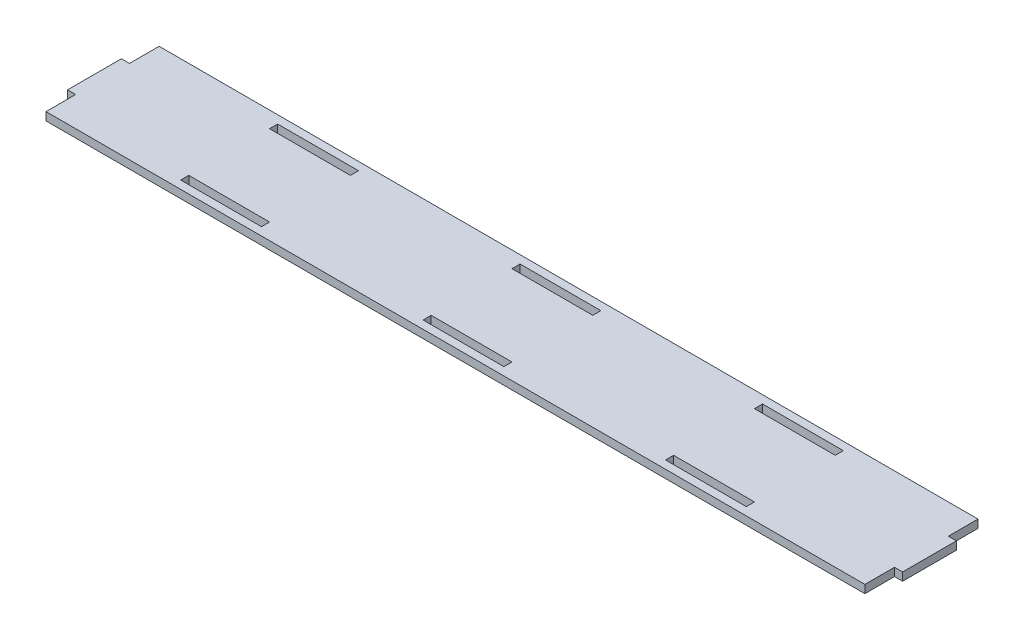
ISO-10303-21;
HEADER;
FILE_DESCRIPTION(('STEP AP214'),'2;1');
FILE_NAME('part.step','',(''),(''),'','','');
FILE_SCHEMA(('AUTOMOTIVE_DESIGN { 1 0 10303 214 1 1 1 1 }'));
ENDSEC;
DATA;
#1=APPLICATION_CONTEXT('core data for automotive mechanical design processes');
#2=APPLICATION_PROTOCOL_DEFINITION('international standard','automotive_design',2000,#1);
#3=PRODUCT_CONTEXT('',#1,'mechanical');
#4=PRODUCT('Part','Part','',(#3));
#5=PRODUCT_RELATED_PRODUCT_CATEGORY('part','',(#4));
#6=PRODUCT_DEFINITION_FORMATION('','',#4);
#7=PRODUCT_DEFINITION_CONTEXT('part definition',#1,'design');
#8=PRODUCT_DEFINITION('design','',#6,#7);
#9=PRODUCT_DEFINITION_SHAPE('','',#8);
#10=(LENGTH_UNIT() NAMED_UNIT(*) SI_UNIT(.MILLI.,.METRE.));
#11=(NAMED_UNIT(*) PLANE_ANGLE_UNIT() SI_UNIT($,.RADIAN.));
#12=(NAMED_UNIT(*) SI_UNIT($,.STERADIAN.) SOLID_ANGLE_UNIT());
#13=UNCERTAINTY_MEASURE_WITH_UNIT(LENGTH_MEASURE(1.E-05),#10,'distance_accuracy_value','');
#14=(GEOMETRIC_REPRESENTATION_CONTEXT(3) GLOBAL_UNCERTAINTY_ASSIGNED_CONTEXT((#13)) GLOBAL_UNIT_ASSIGNED_CONTEXT((#10,
#11,#12)) REPRESENTATION_CONTEXT('',''));
#15=CARTESIAN_POINT('',(0.,0.,0.));
#16=DIRECTION('',(0.,0.,1.));
#17=DIRECTION('',(1.,0.,0.));
#18=AXIS2_PLACEMENT_3D('',#15,#16,#17);
#19=CARTESIAN_POINT('',(0.,3.,0.));
#20=DIRECTION('',(0.,1.,0.));
#21=DIRECTION('',(0.,0.,1.));
#22=AXIS2_PLACEMENT_3D('',#19,#20,#21);
#23=PLANE('',#22);
#24=DIRECTION('',(0.,0.,1.));
#25=VECTOR('',#24,1.);
#26=CARTESIAN_POINT('',(0.,3.,0.));
#27=LINE('',#26,#25);
#28=CARTESIAN_POINT('',(0.,3.,-11.));
#29=VERTEX_POINT('',#28);
#30=CARTESIAN_POINT('',(0.,3.,0.));
#31=VERTEX_POINT('',#30);
#32=EDGE_CURVE('E457',#29,#31,#27,.T.);
#33=ORIENTED_EDGE('',*,*,#32,.T.);
#34=DIRECTION('',(1.,0.,0.));
#35=VECTOR('',#34,1.);
#36=CARTESIAN_POINT('',(0.,3.,0.));
#37=LINE('',#36,#35);
#38=CARTESIAN_POINT('',(304.,3.,0.));
#39=VERTEX_POINT('',#38);
#40=EDGE_CURVE('E460',#31,#39,#37,.T.);
#41=ORIENTED_EDGE('',*,*,#40,.T.);
#42=DIRECTION('',(0.,0.,-1.));
#43=VECTOR('',#42,1.);
#44=CARTESIAN_POINT('',(304.,3.,0.));
#45=LINE('',#44,#43);
#46=CARTESIAN_POINT('',(304.,3.,-11.));
#47=VERTEX_POINT('',#46);
#48=EDGE_CURVE('E463',#39,#47,#45,.T.);
#49=ORIENTED_EDGE('',*,*,#48,.T.);
#50=DIRECTION('',(1.,0.,0.));
#51=VECTOR('',#50,1.);
#52=CARTESIAN_POINT('',(304.,3.,-11.));
#53=LINE('',#52,#51);
#54=CARTESIAN_POINT('',(307.,3.,-11.));
#55=VERTEX_POINT('',#54);
#56=EDGE_CURVE('E465',#47,#55,#53,.T.);
#57=ORIENTED_EDGE('',*,*,#56,.T.);
#58=DIRECTION('',(0.,0.,-1.));
#59=VECTOR('',#58,1.);
#60=CARTESIAN_POINT('',(307.,3.,-31.));
#61=LINE('',#60,#59);
#62=CARTESIAN_POINT('',(307.,3.,-31.));
#63=VERTEX_POINT('',#62);
#64=EDGE_CURVE('E467',#55,#63,#61,.T.);
#65=ORIENTED_EDGE('',*,*,#64,.T.);
#66=DIRECTION('',(-1.,0.,0.));
#67=VECTOR('',#66,1.);
#68=CARTESIAN_POINT('',(304.,3.,-31.));
#69=LINE('',#68,#67);
#70=CARTESIAN_POINT('',(304.,3.,-31.));
#71=VERTEX_POINT('',#70);
#72=EDGE_CURVE('E469',#63,#71,#69,.T.);
#73=ORIENTED_EDGE('',*,*,#72,.T.);
#74=DIRECTION('',(0.,0.,-1.));
#75=VECTOR('',#74,1.);
#76=CARTESIAN_POINT('',(304.,3.,-31.));
#77=LINE('',#76,#75);
#78=CARTESIAN_POINT('',(304.,3.,-42.));
#79=VERTEX_POINT('',#78);
#80=EDGE_CURVE('E471',#71,#79,#77,.T.);
#81=ORIENTED_EDGE('',*,*,#80,.T.);
#82=DIRECTION('',(-1.,0.,0.));
#83=VECTOR('',#82,1.);
#84=CARTESIAN_POINT('',(0.,3.,-42.));
#85=LINE('',#84,#83);
#86=CARTESIAN_POINT('',(0.,3.,-42.));
#87=VERTEX_POINT('',#86);
#88=EDGE_CURVE('E473',#79,#87,#85,.T.);
#89=ORIENTED_EDGE('',*,*,#88,.T.);
#90=DIRECTION('',(0.,0.,1.));
#91=VECTOR('',#90,1.);
#92=CARTESIAN_POINT('',(0.,3.,-31.));
#93=LINE('',#92,#91);
#94=CARTESIAN_POINT('',(0.,3.,-31.));
#95=VERTEX_POINT('',#94);
#96=EDGE_CURVE('E475',#87,#95,#93,.T.);
#97=ORIENTED_EDGE('',*,*,#96,.T.);
#98=DIRECTION('',(-1.,0.,0.));
#99=VECTOR('',#98,1.);
#100=CARTESIAN_POINT('',(0.,3.,-31.));
#101=LINE('',#100,#99);
#102=CARTESIAN_POINT('',(-3.,3.,-31.));
#103=VERTEX_POINT('',#102);
#104=EDGE_CURVE('E477',#95,#103,#101,.T.);
#105=ORIENTED_EDGE('',*,*,#104,.T.);
#106=DIRECTION('',(0.,0.,1.));
#107=VECTOR('',#106,1.);
#108=CARTESIAN_POINT('',(-3.,3.,-31.));
#109=LINE('',#108,#107);
#110=CARTESIAN_POINT('',(-3.,3.,-11.));
#111=VERTEX_POINT('',#110);
#112=EDGE_CURVE('E479',#103,#111,#109,.T.);
#113=ORIENTED_EDGE('',*,*,#112,.T.);
#114=DIRECTION('',(1.,0.,0.));
#115=VECTOR('',#114,1.);
#116=CARTESIAN_POINT('',(0.,3.,-11.));
#117=LINE('',#116,#115);
#118=EDGE_CURVE('E481',#111,#29,#117,.T.);
#119=ORIENTED_EDGE('',*,*,#118,.T.);
#120=EDGE_LOOP('',(#33,#41,#49,#57,#65,#73,#81,#89,#97,#105,#113,#119));
#121=FACE_BOUND('',#120,.T.);
#122=DIRECTION('',(1.,0.,0.));
#123=VECTOR('',#122,1.);
#124=CARTESIAN_POINT('',(47.,3.,-3.));
#125=LINE('',#124,#123);
#126=CARTESIAN_POINT('',(47.,3.,-3.));
#127=VERTEX_POINT('',#126);
#128=CARTESIAN_POINT('',(77.,3.,-3.));
#129=VERTEX_POINT('',#128);
#130=EDGE_CURVE('E428',#127,#129,#125,.T.);
#131=ORIENTED_EDGE('',*,*,#130,.F.);
#132=DIRECTION('',(0.,0.,1.));
#133=VECTOR('',#132,1.);
#134=CARTESIAN_POINT('',(47.,3.,-6.));
#135=LINE('',#134,#133);
#136=CARTESIAN_POINT('',(47.,3.,-6.));
#137=VERTEX_POINT('',#136);
#138=EDGE_CURVE('E426',#137,#127,#135,.T.);
#139=ORIENTED_EDGE('',*,*,#138,.F.);
#140=DIRECTION('',(-1.,0.,0.));
#141=VECTOR('',#140,1.);
#142=CARTESIAN_POINT('',(47.,3.,-6.));
#143=LINE('',#142,#141);
#144=CARTESIAN_POINT('',(77.,3.,-6.));
#145=VERTEX_POINT('',#144);
#146=EDGE_CURVE('E434',#145,#137,#143,.T.);
#147=ORIENTED_EDGE('',*,*,#146,.F.);
#148=DIRECTION('',(0.,0.,-1.));
#149=VECTOR('',#148,1.);
#150=CARTESIAN_POINT('',(77.,3.,-6.));
#151=LINE('',#150,#149);
#152=EDGE_CURVE('E431',#129,#145,#151,.T.);
#153=ORIENTED_EDGE('',*,*,#152,.F.);
#154=EDGE_LOOP('',(#131,#139,#147,#153));
#155=FACE_BOUND('',#154,.T.);
#156=DIRECTION('',(1.,0.,0.));
#157=VECTOR('',#156,1.);
#158=CARTESIAN_POINT('',(137.,3.,-3.));
#159=LINE('',#158,#157);
#160=CARTESIAN_POINT('',(137.,3.,-3.));
#161=VERTEX_POINT('',#160);
#162=CARTESIAN_POINT('',(167.,3.,-3.00000000000001));
#163=VERTEX_POINT('',#162);
#164=EDGE_CURVE('E397',#161,#163,#159,.T.);
#165=ORIENTED_EDGE('',*,*,#164,.F.);
#166=DIRECTION('',(0.,0.,1.));
#167=VECTOR('',#166,1.);
#168=CARTESIAN_POINT('',(137.,3.,-6.00000000000001));
#169=LINE('',#168,#167);
#170=CARTESIAN_POINT('',(137.,3.,-6.00000000000001));
#171=VERTEX_POINT('',#170);
#172=EDGE_CURVE('E395',#171,#161,#169,.T.);
#173=ORIENTED_EDGE('',*,*,#172,.F.);
#174=DIRECTION('',(-1.,0.,0.));
#175=VECTOR('',#174,1.);
#176=CARTESIAN_POINT('',(137.,3.,-6.00000000000001));
#177=LINE('',#176,#175);
#178=CARTESIAN_POINT('',(167.,3.,-6.00000000000001));
#179=VERTEX_POINT('',#178);
#180=EDGE_CURVE('E403',#179,#171,#177,.T.);
#181=ORIENTED_EDGE('',*,*,#180,.F.);
#182=DIRECTION('',(0.,0.,-1.));
#183=VECTOR('',#182,1.);
#184=CARTESIAN_POINT('',(167.,3.,-6.00000000000001));
#185=LINE('',#184,#183);
#186=EDGE_CURVE('E400',#163,#179,#185,.T.);
#187=ORIENTED_EDGE('',*,*,#186,.F.);
#188=EDGE_LOOP('',(#165,#173,#181,#187));
#189=FACE_BOUND('',#188,.T.);
#190=DIRECTION('',(1.,0.,0.));
#191=VECTOR('',#190,1.);
#192=CARTESIAN_POINT('',(227.,3.,-3.));
#193=LINE('',#192,#191);
#194=CARTESIAN_POINT('',(227.,3.,-3.));
#195=VERTEX_POINT('',#194);
#196=CARTESIAN_POINT('',(257.,3.,-3.));
#197=VERTEX_POINT('',#196);
#198=EDGE_CURVE('E366',#195,#197,#193,.T.);
#199=ORIENTED_EDGE('',*,*,#198,.F.);
#200=DIRECTION('',(0.,0.,1.));
#201=VECTOR('',#200,1.);
#202=CARTESIAN_POINT('',(227.,3.,-6.));
#203=LINE('',#202,#201);
#204=CARTESIAN_POINT('',(227.,3.,-6.));
#205=VERTEX_POINT('',#204);
#206=EDGE_CURVE('E364',#205,#195,#203,.T.);
#207=ORIENTED_EDGE('',*,*,#206,.F.);
#208=DIRECTION('',(-1.,0.,0.));
#209=VECTOR('',#208,1.);
#210=CARTESIAN_POINT('',(227.,3.,-6.));
#211=LINE('',#210,#209);
#212=CARTESIAN_POINT('',(257.,3.,-6.));
#213=VERTEX_POINT('',#212);
#214=EDGE_CURVE('E372',#213,#205,#211,.T.);
#215=ORIENTED_EDGE('',*,*,#214,.F.);
#216=DIRECTION('',(0.,0.,-1.));
#217=VECTOR('',#216,1.);
#218=CARTESIAN_POINT('',(257.,3.,-6.));
#219=LINE('',#218,#217);
#220=EDGE_CURVE('E369',#197,#213,#219,.T.);
#221=ORIENTED_EDGE('',*,*,#220,.F.);
#222=EDGE_LOOP('',(#199,#207,#215,#221));
#223=FACE_BOUND('',#222,.T.);
#224=DIRECTION('',(0.,0.,-1.));
#225=VECTOR('',#224,1.);
#226=CARTESIAN_POINT('',(257.,3.,-36.));
#227=LINE('',#226,#225);
#228=CARTESIAN_POINT('',(257.,3.,-36.));
#229=VERTEX_POINT('',#228);
#230=CARTESIAN_POINT('',(257.,3.,-39.));
#231=VERTEX_POINT('',#230);
#232=EDGE_CURVE('E335',#229,#231,#227,.T.);
#233=ORIENTED_EDGE('',*,*,#232,.F.);
#234=DIRECTION('',(1.,0.,0.));
#235=VECTOR('',#234,1.);
#236=CARTESIAN_POINT('',(227.,3.,-36.));
#237=LINE('',#236,#235);
#238=CARTESIAN_POINT('',(227.,3.,-36.));
#239=VERTEX_POINT('',#238);
#240=EDGE_CURVE('E333',#239,#229,#237,.T.);
#241=ORIENTED_EDGE('',*,*,#240,.F.);
#242=DIRECTION('',(0.,0.,1.));
#243=VECTOR('',#242,1.);
#244=CARTESIAN_POINT('',(227.,3.,-36.));
#245=LINE('',#244,#243);
#246=CARTESIAN_POINT('',(227.,3.,-39.));
#247=VERTEX_POINT('',#246);
#248=EDGE_CURVE('E341',#247,#239,#245,.T.);
#249=ORIENTED_EDGE('',*,*,#248,.F.);
#250=DIRECTION('',(-1.,0.,0.));
#251=VECTOR('',#250,1.);
#252=CARTESIAN_POINT('',(227.,3.,-39.));
#253=LINE('',#252,#251);
#254=EDGE_CURVE('E338',#231,#247,#253,.T.);
#255=ORIENTED_EDGE('',*,*,#254,.F.);
#256=EDGE_LOOP('',(#233,#241,#249,#255));
#257=FACE_BOUND('',#256,.T.);
#258=DIRECTION('',(0.,0.,-1.));
#259=VECTOR('',#258,1.);
#260=CARTESIAN_POINT('',(167.,3.,-36.));
#261=LINE('',#260,#259);
#262=CARTESIAN_POINT('',(167.,3.,-36.));
#263=VERTEX_POINT('',#262);
#264=CARTESIAN_POINT('',(167.,3.,-39.));
#265=VERTEX_POINT('',#264);
#266=EDGE_CURVE('E304',#263,#265,#261,.T.);
#267=ORIENTED_EDGE('',*,*,#266,.F.);
#268=DIRECTION('',(1.,0.,0.));
#269=VECTOR('',#268,1.);
#270=CARTESIAN_POINT('',(137.,3.,-36.));
#271=LINE('',#270,#269);
#272=CARTESIAN_POINT('',(137.,3.,-36.));
#273=VERTEX_POINT('',#272);
#274=EDGE_CURVE('E302',#273,#263,#271,.T.);
#275=ORIENTED_EDGE('',*,*,#274,.F.);
#276=DIRECTION('',(0.,0.,1.));
#277=VECTOR('',#276,1.);
#278=CARTESIAN_POINT('',(137.,3.,-36.));
#279=LINE('',#278,#277);
#280=CARTESIAN_POINT('',(137.,3.,-39.));
#281=VERTEX_POINT('',#280);
#282=EDGE_CURVE('E310',#281,#273,#279,.T.);
#283=ORIENTED_EDGE('',*,*,#282,.F.);
#284=DIRECTION('',(-1.,0.,0.));
#285=VECTOR('',#284,1.);
#286=CARTESIAN_POINT('',(137.,3.,-39.));
#287=LINE('',#286,#285);
#288=EDGE_CURVE('E307',#265,#281,#287,.T.);
#289=ORIENTED_EDGE('',*,*,#288,.F.);
#290=EDGE_LOOP('',(#267,#275,#283,#289));
#291=FACE_BOUND('',#290,.T.);
#292=DIRECTION('',(0.,0.,-1.));
#293=VECTOR('',#292,1.);
#294=CARTESIAN_POINT('',(77.,3.,-36.));
#295=LINE('',#294,#293);
#296=CARTESIAN_POINT('',(77.,3.,-36.));
#297=VERTEX_POINT('',#296);
#298=CARTESIAN_POINT('',(77.,3.,-39.));
#299=VERTEX_POINT('',#298);
#300=EDGE_CURVE('E274',#297,#299,#295,.T.);
#301=ORIENTED_EDGE('',*,*,#300,.F.);
#302=DIRECTION('',(1.,0.,0.));
#303=VECTOR('',#302,1.);
#304=CARTESIAN_POINT('',(47.,3.,-36.));
#305=LINE('',#304,#303);
#306=CARTESIAN_POINT('',(47.,3.,-36.));
#307=VERTEX_POINT('',#306);
#308=EDGE_CURVE('E266',#307,#297,#305,.T.);
#309=ORIENTED_EDGE('',*,*,#308,.F.);
#310=DIRECTION('',(0.,0.,1.));
#311=VECTOR('',#310,1.);
#312=CARTESIAN_POINT('',(47.,3.,-36.));
#313=LINE('',#312,#311);
#314=CARTESIAN_POINT('',(47.,3.,-39.));
#315=VERTEX_POINT('',#314);
#316=EDGE_CURVE('E288',#315,#307,#313,.T.);
#317=ORIENTED_EDGE('',*,*,#316,.F.);
#318=DIRECTION('',(-1.,0.,0.));
#319=VECTOR('',#318,1.);
#320=CARTESIAN_POINT('',(47.,3.,-39.));
#321=LINE('',#320,#319);
#322=EDGE_CURVE('E286',#299,#315,#321,.T.);
#323=ORIENTED_EDGE('',*,*,#322,.F.);
#324=EDGE_LOOP('',(#301,#309,#317,#323));
#325=FACE_BOUND('',#324,.T.);
#326=ADVANCED_FACE('F33',(#121,#155,#189,#223,#257,#291,#325),#23,.T.);
#327=CARTESIAN_POINT('',(0.,0.,0.));
#328=DIRECTION('',(0.,1.,0.));
#329=DIRECTION('',(0.,0.,1.));
#330=AXIS2_PLACEMENT_3D('',#327,#328,#329);
#331=PLANE('',#330);
#332=DIRECTION('',(1.,0.,0.));
#333=VECTOR('',#332,1.);
#334=CARTESIAN_POINT('',(137.,0.,-36.));
#335=LINE('',#334,#333);
#336=CARTESIAN_POINT('',(137.,0.,-36.));
#337=VERTEX_POINT('',#336);
#338=CARTESIAN_POINT('',(167.,0.,-36.));
#339=VERTEX_POINT('',#338);
#340=EDGE_CURVE('E282',#337,#339,#335,.T.);
#341=ORIENTED_EDGE('',*,*,#340,.T.);
#342=DIRECTION('',(0.,0.,-1.));
#343=VECTOR('',#342,1.);
#344=CARTESIAN_POINT('',(167.,0.,-36.));
#345=LINE('',#344,#343);
#346=CARTESIAN_POINT('',(167.,0.,-39.));
#347=VERTEX_POINT('',#346);
#348=EDGE_CURVE('E315',#339,#347,#345,.T.);
#349=ORIENTED_EDGE('',*,*,#348,.T.);
#350=DIRECTION('',(-1.,0.,0.));
#351=VECTOR('',#350,1.);
#352=CARTESIAN_POINT('',(137.,0.,-39.));
#353=LINE('',#352,#351);
#354=CARTESIAN_POINT('',(137.,0.,-39.));
#355=VERTEX_POINT('',#354);
#356=EDGE_CURVE('E318',#347,#355,#353,.T.);
#357=ORIENTED_EDGE('',*,*,#356,.T.);
#358=DIRECTION('',(0.,0.,1.));
#359=VECTOR('',#358,1.);
#360=CARTESIAN_POINT('',(137.,0.,-36.));
#361=LINE('',#360,#359);
#362=EDGE_CURVE('E305',#355,#337,#361,.T.);
#363=ORIENTED_EDGE('',*,*,#362,.T.);
#364=EDGE_LOOP('',(#341,#349,#357,#363));
#365=FACE_BOUND('',#364,.T.);
#366=DIRECTION('',(0.,0.,1.));
#367=VECTOR('',#366,1.);
#368=CARTESIAN_POINT('',(227.,0.,-6.));
#369=LINE('',#368,#367);
#370=CARTESIAN_POINT('',(227.,0.,-6.));
#371=VERTEX_POINT('',#370);
#372=CARTESIAN_POINT('',(227.,0.,-3.));
#373=VERTEX_POINT('',#372);
#374=EDGE_CURVE('E363',#371,#373,#369,.T.);
#375=ORIENTED_EDGE('',*,*,#374,.T.);
#376=DIRECTION('',(1.,0.,0.));
#377=VECTOR('',#376,1.);
#378=CARTESIAN_POINT('',(227.,0.,-3.));
#379=LINE('',#378,#377);
#380=CARTESIAN_POINT('',(257.,0.,-3.));
#381=VERTEX_POINT('',#380);
#382=EDGE_CURVE('E377',#373,#381,#379,.T.);
#383=ORIENTED_EDGE('',*,*,#382,.T.);
#384=DIRECTION('',(0.,0.,-1.));
#385=VECTOR('',#384,1.);
#386=CARTESIAN_POINT('',(257.,0.,-6.));
#387=LINE('',#386,#385);
#388=CARTESIAN_POINT('',(257.,0.,-6.));
#389=VERTEX_POINT('',#388);
#390=EDGE_CURVE('E380',#381,#389,#387,.T.);
#391=ORIENTED_EDGE('',*,*,#390,.T.);
#392=DIRECTION('',(-1.,0.,0.));
#393=VECTOR('',#392,1.);
#394=CARTESIAN_POINT('',(227.,0.,-6.));
#395=LINE('',#394,#393);
#396=EDGE_CURVE('E367',#389,#371,#395,.T.);
#397=ORIENTED_EDGE('',*,*,#396,.T.);
#398=EDGE_LOOP('',(#375,#383,#391,#397));
#399=FACE_BOUND('',#398,.T.);
#400=DIRECTION('',(0.,0.,1.));
#401=VECTOR('',#400,1.);
#402=CARTESIAN_POINT('',(47.,0.,-6.));
#403=LINE('',#402,#401);
#404=CARTESIAN_POINT('',(47.,0.,-6.));
#405=VERTEX_POINT('',#404);
#406=CARTESIAN_POINT('',(47.,0.,-3.));
#407=VERTEX_POINT('',#406);
#408=EDGE_CURVE('E425',#405,#407,#403,.T.);
#409=ORIENTED_EDGE('',*,*,#408,.T.);
#410=DIRECTION('',(1.,0.,0.));
#411=VECTOR('',#410,1.);
#412=CARTESIAN_POINT('',(47.,0.,-3.));
#413=LINE('',#412,#411);
#414=CARTESIAN_POINT('',(77.,0.,-3.));
#415=VERTEX_POINT('',#414);
#416=EDGE_CURVE('E439',#407,#415,#413,.T.);
#417=ORIENTED_EDGE('',*,*,#416,.T.);
#418=DIRECTION('',(0.,0.,-1.));
#419=VECTOR('',#418,1.);
#420=CARTESIAN_POINT('',(77.,0.,-6.));
#421=LINE('',#420,#419);
#422=CARTESIAN_POINT('',(77.,0.,-6.));
#423=VERTEX_POINT('',#422);
#424=EDGE_CURVE('E442',#415,#423,#421,.T.);
#425=ORIENTED_EDGE('',*,*,#424,.T.);
#426=DIRECTION('',(-1.,0.,0.));
#427=VECTOR('',#426,1.);
#428=CARTESIAN_POINT('',(47.,0.,-6.));
#429=LINE('',#428,#427);
#430=EDGE_CURVE('E429',#423,#405,#429,.T.);
#431=ORIENTED_EDGE('',*,*,#430,.T.);
#432=EDGE_LOOP('',(#409,#417,#425,#431));
#433=FACE_BOUND('',#432,.T.);
#434=DIRECTION('',(0.,0.,1.));
#435=VECTOR('',#434,1.);
#436=CARTESIAN_POINT('',(0.,0.,0.));
#437=LINE('',#436,#435);
#438=CARTESIAN_POINT('',(0.,0.,-11.));
#439=VERTEX_POINT('',#438);
#440=CARTESIAN_POINT('',(0.,0.,0.));
#441=VERTEX_POINT('',#440);
#442=EDGE_CURVE('E456',#439,#441,#437,.T.);
#443=ORIENTED_EDGE('',*,*,#442,.F.);
#444=DIRECTION('',(1.,0.,0.));
#445=VECTOR('',#444,1.);
#446=CARTESIAN_POINT('',(0.,0.,-11.));
#447=LINE('',#446,#445);
#448=CARTESIAN_POINT('',(-3.,0.,-11.));
#449=VERTEX_POINT('',#448);
#450=EDGE_CURVE('E461',#449,#439,#447,.T.);
#451=ORIENTED_EDGE('',*,*,#450,.F.);
#452=DIRECTION('',(0.,0.,1.));
#453=VECTOR('',#452,1.);
#454=CARTESIAN_POINT('',(-3.,0.,-31.));
#455=LINE('',#454,#453);
#456=CARTESIAN_POINT('',(-3.,0.,-31.));
#457=VERTEX_POINT('',#456);
#458=EDGE_CURVE('E504',#457,#449,#455,.T.);
#459=ORIENTED_EDGE('',*,*,#458,.F.);
#460=DIRECTION('',(-1.,0.,0.));
#461=VECTOR('',#460,1.);
#462=CARTESIAN_POINT('',(0.,0.,-31.));
#463=LINE('',#462,#461);
#464=CARTESIAN_POINT('',(0.,0.,-31.));
#465=VERTEX_POINT('',#464);
#466=EDGE_CURVE('E502',#465,#457,#463,.T.);
#467=ORIENTED_EDGE('',*,*,#466,.F.);
#468=DIRECTION('',(0.,0.,1.));
#469=VECTOR('',#468,1.);
#470=CARTESIAN_POINT('',(0.,0.,-31.));
#471=LINE('',#470,#469);
#472=CARTESIAN_POINT('',(0.,0.,-42.));
#473=VERTEX_POINT('',#472);
#474=EDGE_CURVE('E500',#473,#465,#471,.T.);
#475=ORIENTED_EDGE('',*,*,#474,.F.);
#476=DIRECTION('',(-1.,0.,0.));
#477=VECTOR('',#476,1.);
#478=CARTESIAN_POINT('',(0.,0.,-42.));
#479=LINE('',#478,#477);
#480=CARTESIAN_POINT('',(304.,0.,-42.));
#481=VERTEX_POINT('',#480);
#482=EDGE_CURVE('E498',#481,#473,#479,.T.);
#483=ORIENTED_EDGE('',*,*,#482,.F.);
#484=DIRECTION('',(0.,0.,-1.));
#485=VECTOR('',#484,1.);
#486=CARTESIAN_POINT('',(304.,0.,-31.));
#487=LINE('',#486,#485);
#488=CARTESIAN_POINT('',(304.,0.,-31.));
#489=VERTEX_POINT('',#488);
#490=EDGE_CURVE('E496',#489,#481,#487,.T.);
#491=ORIENTED_EDGE('',*,*,#490,.F.);
#492=DIRECTION('',(-1.,0.,0.));
#493=VECTOR('',#492,1.);
#494=CARTESIAN_POINT('',(304.,0.,-31.));
#495=LINE('',#494,#493);
#496=CARTESIAN_POINT('',(307.,0.,-31.));
#497=VERTEX_POINT('',#496);
#498=EDGE_CURVE('E494',#497,#489,#495,.T.);
#499=ORIENTED_EDGE('',*,*,#498,.F.);
#500=DIRECTION('',(0.,0.,-1.));
#501=VECTOR('',#500,1.);
#502=CARTESIAN_POINT('',(307.,0.,-31.));
#503=LINE('',#502,#501);
#504=CARTESIAN_POINT('',(307.,0.,-11.));
#505=VERTEX_POINT('',#504);
#506=EDGE_CURVE('E492',#505,#497,#503,.T.);
#507=ORIENTED_EDGE('',*,*,#506,.F.);
#508=DIRECTION('',(1.,0.,0.));
#509=VECTOR('',#508,1.);
#510=CARTESIAN_POINT('',(304.,0.,-11.));
#511=LINE('',#510,#509);
#512=CARTESIAN_POINT('',(304.,0.,-11.));
#513=VERTEX_POINT('',#512);
#514=EDGE_CURVE('E490',#513,#505,#511,.T.);
#515=ORIENTED_EDGE('',*,*,#514,.F.);
#516=DIRECTION('',(0.,0.,-1.));
#517=VECTOR('',#516,1.);
#518=CARTESIAN_POINT('',(304.,0.,0.));
#519=LINE('',#518,#517);
#520=CARTESIAN_POINT('',(304.,0.,0.));
#521=VERTEX_POINT('',#520);
#522=EDGE_CURVE('E488',#521,#513,#519,.T.);
#523=ORIENTED_EDGE('',*,*,#522,.F.);
#524=DIRECTION('',(1.,0.,0.));
#525=VECTOR('',#524,1.);
#526=CARTESIAN_POINT('',(0.,0.,0.));
#527=LINE('',#526,#525);
#528=EDGE_CURVE('E486',#441,#521,#527,.T.);
#529=ORIENTED_EDGE('',*,*,#528,.F.);
#530=EDGE_LOOP('',(#443,#451,#459,#467,#475,#483,#491,#499,#507,#515,#523,#529));
#531=FACE_BOUND('',#530,.T.);
#532=DIRECTION('',(0.,0.,1.));
#533=VECTOR('',#532,1.);
#534=CARTESIAN_POINT('',(137.,0.,-6.00000000000001));
#535=LINE('',#534,#533);
#536=CARTESIAN_POINT('',(137.,0.,-6.00000000000001));
#537=VERTEX_POINT('',#536);
#538=CARTESIAN_POINT('',(137.,0.,-3.));
#539=VERTEX_POINT('',#538);
#540=EDGE_CURVE('E394',#537,#539,#535,.T.);
#541=ORIENTED_EDGE('',*,*,#540,.T.);
#542=DIRECTION('',(1.,0.,0.));
#543=VECTOR('',#542,1.);
#544=CARTESIAN_POINT('',(137.,0.,-3.));
#545=LINE('',#544,#543);
#546=CARTESIAN_POINT('',(167.,0.,-3.00000000000001));
#547=VERTEX_POINT('',#546);
#548=EDGE_CURVE('E408',#539,#547,#545,.T.);
#549=ORIENTED_EDGE('',*,*,#548,.T.);
#550=DIRECTION('',(0.,0.,-1.));
#551=VECTOR('',#550,1.);
#552=CARTESIAN_POINT('',(167.,0.,-6.00000000000001));
#553=LINE('',#552,#551);
#554=CARTESIAN_POINT('',(167.,0.,-6.00000000000001));
#555=VERTEX_POINT('',#554);
#556=EDGE_CURVE('E411',#547,#555,#553,.T.);
#557=ORIENTED_EDGE('',*,*,#556,.T.);
#558=DIRECTION('',(-1.,0.,0.));
#559=VECTOR('',#558,1.);
#560=CARTESIAN_POINT('',(137.,0.,-6.00000000000001));
#561=LINE('',#560,#559);
#562=EDGE_CURVE('E398',#555,#537,#561,.T.);
#563=ORIENTED_EDGE('',*,*,#562,.T.);
#564=EDGE_LOOP('',(#541,#549,#557,#563));
#565=FACE_BOUND('',#564,.T.);
#566=DIRECTION('',(1.,0.,0.));
#567=VECTOR('',#566,1.);
#568=CARTESIAN_POINT('',(227.,0.,-36.));
#569=LINE('',#568,#567);
#570=CARTESIAN_POINT('',(227.,0.,-36.));
#571=VERTEX_POINT('',#570);
#572=CARTESIAN_POINT('',(257.,0.,-36.));
#573=VERTEX_POINT('',#572);
#574=EDGE_CURVE('E332',#571,#573,#569,.T.);
#575=ORIENTED_EDGE('',*,*,#574,.T.);
#576=DIRECTION('',(0.,0.,-1.));
#577=VECTOR('',#576,1.);
#578=CARTESIAN_POINT('',(257.,0.,-36.));
#579=LINE('',#578,#577);
#580=CARTESIAN_POINT('',(257.,0.,-39.));
#581=VERTEX_POINT('',#580);
#582=EDGE_CURVE('E346',#573,#581,#579,.T.);
#583=ORIENTED_EDGE('',*,*,#582,.T.);
#584=DIRECTION('',(-1.,0.,0.));
#585=VECTOR('',#584,1.);
#586=CARTESIAN_POINT('',(227.,0.,-39.));
#587=LINE('',#586,#585);
#588=CARTESIAN_POINT('',(227.,0.,-39.));
#589=VERTEX_POINT('',#588);
#590=EDGE_CURVE('E349',#581,#589,#587,.T.);
#591=ORIENTED_EDGE('',*,*,#590,.T.);
#592=DIRECTION('',(0.,0.,1.));
#593=VECTOR('',#592,1.);
#594=CARTESIAN_POINT('',(227.,0.,-36.));
#595=LINE('',#594,#593);
#596=EDGE_CURVE('E336',#589,#571,#595,.T.);
#597=ORIENTED_EDGE('',*,*,#596,.T.);
#598=EDGE_LOOP('',(#575,#583,#591,#597));
#599=FACE_BOUND('',#598,.T.);
#600=DIRECTION('',(1.,0.,0.));
#601=VECTOR('',#600,1.);
#602=CARTESIAN_POINT('',(47.,0.,-36.));
#603=LINE('',#602,#601);
#604=CARTESIAN_POINT('',(47.,0.,-36.));
#605=VERTEX_POINT('',#604);
#606=CARTESIAN_POINT('',(77.,0.,-36.));
#607=VERTEX_POINT('',#606);
#608=EDGE_CURVE('E56',#605,#607,#603,.T.);
#609=ORIENTED_EDGE('',*,*,#608,.T.);
#610=DIRECTION('',(0.,0.,-1.));
#611=VECTOR('',#610,1.);
#612=CARTESIAN_POINT('',(77.,0.,-36.));
#613=LINE('',#612,#611);
#614=CARTESIAN_POINT('',(77.,0.,-39.));
#615=VERTEX_POINT('',#614);
#616=EDGE_CURVE('E281',#607,#615,#613,.T.);
#617=ORIENTED_EDGE('',*,*,#616,.T.);
#618=DIRECTION('',(-1.,0.,0.));
#619=VECTOR('',#618,1.);
#620=CARTESIAN_POINT('',(47.,0.,-39.));
#621=LINE('',#620,#619);
#622=CARTESIAN_POINT('',(47.,0.,-39.));
#623=VERTEX_POINT('',#622);
#624=EDGE_CURVE('E294',#615,#623,#621,.T.);
#625=ORIENTED_EDGE('',*,*,#624,.T.);
#626=DIRECTION('',(0.,0.,1.));
#627=VECTOR('',#626,1.);
#628=CARTESIAN_POINT('',(47.,0.,-36.));
#629=LINE('',#628,#627);
#630=EDGE_CURVE('E275',#623,#605,#629,.T.);
#631=ORIENTED_EDGE('',*,*,#630,.T.);
#632=EDGE_LOOP('',(#609,#617,#625,#631));
#633=FACE_BOUND('',#632,.T.);
#634=ADVANCED_FACE('F546',(#365,#399,#433,#531,#565,#599,#633),#331,.F.);
#635=CARTESIAN_POINT('',(0.,3.,0.));
#636=DIRECTION('',(1.,0.,0.));
#637=DIRECTION('',(0.,0.,-1.));
#638=AXIS2_PLACEMENT_3D('',#635,#636,#637);
#639=PLANE('',#638);
#640=ORIENTED_EDGE('',*,*,#442,.T.);
#641=DIRECTION('',(0.,-1.,0.));
#642=VECTOR('',#641,1.);
#643=CARTESIAN_POINT('',(0.,3.,0.));
#644=LINE('',#643,#642);
#645=EDGE_CURVE('E11',#31,#441,#644,.T.);
#646=ORIENTED_EDGE('',*,*,#645,.F.);
#647=ORIENTED_EDGE('',*,*,#32,.F.);
#648=DIRECTION('',(0.,-1.,0.));
#649=VECTOR('',#648,1.);
#650=CARTESIAN_POINT('',(0.,3.,-11.));
#651=LINE('',#650,#649);
#652=EDGE_CURVE('E483',#29,#439,#651,.T.);
#653=ORIENTED_EDGE('',*,*,#652,.T.);
#654=EDGE_LOOP('',(#640,#646,#647,#653));
#655=FACE_BOUND('',#654,.T.);
#656=ADVANCED_FACE('F35',(#655),#639,.F.);
#657=CARTESIAN_POINT('',(0.,3.,0.));
#658=DIRECTION('',(0.,0.,-1.));
#659=DIRECTION('',(-1.,0.,0.));
#660=AXIS2_PLACEMENT_3D('',#657,#658,#659);
#661=PLANE('',#660);
#662=ORIENTED_EDGE('',*,*,#528,.T.);
#663=DIRECTION('',(0.,-1.,0.));
#664=VECTOR('',#663,1.);
#665=CARTESIAN_POINT('',(304.,3.,0.));
#666=LINE('',#665,#664);
#667=EDGE_CURVE('E41',#39,#521,#666,.T.);
#668=ORIENTED_EDGE('',*,*,#667,.F.);
#669=ORIENTED_EDGE('',*,*,#40,.F.);
#670=ORIENTED_EDGE('',*,*,#645,.T.);
#671=EDGE_LOOP('',(#662,#668,#669,#670));
#672=FACE_BOUND('',#671,.T.);
#673=ADVANCED_FACE('F564',(#672),#661,.F.);
#674=CARTESIAN_POINT('',(304.,3.,0.));
#675=DIRECTION('',(-1.,0.,0.));
#676=DIRECTION('',(0.,0.,1.));
#677=AXIS2_PLACEMENT_3D('',#674,#675,#676);
#678=PLANE('',#677);
#679=ORIENTED_EDGE('',*,*,#522,.T.);
#680=DIRECTION('',(0.,-1.,0.));
#681=VECTOR('',#680,1.);
#682=CARTESIAN_POINT('',(304.,3.,-11.));
#683=LINE('',#682,#681);
#684=EDGE_CURVE('E533',#47,#513,#683,.T.);
#685=ORIENTED_EDGE('',*,*,#684,.F.);
#686=ORIENTED_EDGE('',*,*,#48,.F.);
#687=ORIENTED_EDGE('',*,*,#667,.T.);
#688=EDGE_LOOP('',(#679,#685,#686,#687));
#689=FACE_BOUND('',#688,.T.);
#690=ADVANCED_FACE('F540',(#689),#678,.F.);
#691=CARTESIAN_POINT('',(304.,3.,-11.));
#692=DIRECTION('',(0.,0.,-1.));
#693=DIRECTION('',(-1.,0.,0.));
#694=AXIS2_PLACEMENT_3D('',#691,#692,#693);
#695=PLANE('',#694);
#696=ORIENTED_EDGE('',*,*,#514,.T.);
#697=DIRECTION('',(0.,-1.,0.));
#698=VECTOR('',#697,1.);
#699=CARTESIAN_POINT('',(307.,3.,-11.));
#700=LINE('',#699,#698);
#701=EDGE_CURVE('E530',#55,#505,#700,.T.);
#702=ORIENTED_EDGE('',*,*,#701,.F.);
#703=ORIENTED_EDGE('',*,*,#56,.F.);
#704=ORIENTED_EDGE('',*,*,#684,.T.);
#705=EDGE_LOOP('',(#696,#702,#703,#704));
#706=FACE_BOUND('',#705,.T.);
#707=ADVANCED_FACE('F552',(#706),#695,.F.);
#708=CARTESIAN_POINT('',(307.,3.,-31.));
#709=DIRECTION('',(-1.,0.,0.));
#710=DIRECTION('',(0.,0.,1.));
#711=AXIS2_PLACEMENT_3D('',#708,#709,#710);
#712=PLANE('',#711);
#713=ORIENTED_EDGE('',*,*,#506,.T.);
#714=DIRECTION('',(0.,-1.,0.));
#715=VECTOR('',#714,1.);
#716=CARTESIAN_POINT('',(307.,3.,-31.));
#717=LINE('',#716,#715);
#718=EDGE_CURVE('E527',#63,#497,#717,.T.);
#719=ORIENTED_EDGE('',*,*,#718,.F.);
#720=ORIENTED_EDGE('',*,*,#64,.F.);
#721=ORIENTED_EDGE('',*,*,#701,.T.);
#722=EDGE_LOOP('',(#713,#719,#720,#721));
#723=FACE_BOUND('',#722,.T.);
#724=ADVANCED_FACE('F556',(#723),#712,.F.);
#725=CARTESIAN_POINT('',(304.,3.,-31.));
#726=DIRECTION('',(0.,0.,1.));
#727=DIRECTION('',(1.,0.,0.));
#728=AXIS2_PLACEMENT_3D('',#725,#726,#727);
#729=PLANE('',#728);
#730=ORIENTED_EDGE('',*,*,#498,.T.);
#731=DIRECTION('',(0.,-1.,0.));
#732=VECTOR('',#731,1.);
#733=CARTESIAN_POINT('',(304.,3.,-31.));
#734=LINE('',#733,#732);
#735=EDGE_CURVE('E524',#71,#489,#734,.T.);
#736=ORIENTED_EDGE('',*,*,#735,.F.);
#737=ORIENTED_EDGE('',*,*,#72,.F.);
#738=ORIENTED_EDGE('',*,*,#718,.T.);
#739=EDGE_LOOP('',(#730,#736,#737,#738));
#740=FACE_BOUND('',#739,.T.);
#741=ADVANCED_FACE('F597',(#740),#729,.F.);
#742=CARTESIAN_POINT('',(304.,3.,-31.));
#743=DIRECTION('',(-1.,0.,0.));
#744=DIRECTION('',(0.,0.,1.));
#745=AXIS2_PLACEMENT_3D('',#742,#743,#744);
#746=PLANE('',#745);
#747=ORIENTED_EDGE('',*,*,#490,.T.);
#748=DIRECTION('',(0.,-1.,0.));
#749=VECTOR('',#748,1.);
#750=CARTESIAN_POINT('',(304.,3.,-42.));
#751=LINE('',#750,#749);
#752=EDGE_CURVE('E521',#79,#481,#751,.T.);
#753=ORIENTED_EDGE('',*,*,#752,.F.);
#754=ORIENTED_EDGE('',*,*,#80,.F.);
#755=ORIENTED_EDGE('',*,*,#735,.T.);
#756=EDGE_LOOP('',(#747,#753,#754,#755));
#757=FACE_BOUND('',#756,.T.);
#758=ADVANCED_FACE('F595',(#757),#746,.F.);
#759=CARTESIAN_POINT('',(0.,3.,-42.));
#760=DIRECTION('',(0.,0.,1.));
#761=DIRECTION('',(1.,0.,0.));
#762=AXIS2_PLACEMENT_3D('',#759,#760,#761);
#763=PLANE('',#762);
#764=ORIENTED_EDGE('',*,*,#482,.T.);
#765=DIRECTION('',(0.,-1.,0.));
#766=VECTOR('',#765,1.);
#767=CARTESIAN_POINT('',(0.,3.,-42.));
#768=LINE('',#767,#766);
#769=EDGE_CURVE('E518',#87,#473,#768,.T.);
#770=ORIENTED_EDGE('',*,*,#769,.F.);
#771=ORIENTED_EDGE('',*,*,#88,.F.);
#772=ORIENTED_EDGE('',*,*,#752,.T.);
#773=EDGE_LOOP('',(#764,#770,#771,#772));
#774=FACE_BOUND('',#773,.T.);
#775=ADVANCED_FACE('F591',(#774),#763,.F.);
#776=CARTESIAN_POINT('',(0.,3.,-31.));
#777=DIRECTION('',(1.,0.,0.));
#778=DIRECTION('',(0.,0.,-1.));
#779=AXIS2_PLACEMENT_3D('',#776,#777,#778);
#780=PLANE('',#779);
#781=ORIENTED_EDGE('',*,*,#474,.T.);
#782=DIRECTION('',(0.,-1.,0.));
#783=VECTOR('',#782,1.);
#784=CARTESIAN_POINT('',(0.,3.,-31.));
#785=LINE('',#784,#783);
#786=EDGE_CURVE('E515',#95,#465,#785,.T.);
#787=ORIENTED_EDGE('',*,*,#786,.F.);
#788=ORIENTED_EDGE('',*,*,#96,.F.);
#789=ORIENTED_EDGE('',*,*,#769,.T.);
#790=EDGE_LOOP('',(#781,#787,#788,#789));
#791=FACE_BOUND('',#790,.T.);
#792=ADVANCED_FACE('F586',(#791),#780,.F.);
#793=CARTESIAN_POINT('',(0.,3.,-31.));
#794=DIRECTION('',(0.,0.,1.));
#795=DIRECTION('',(1.,0.,0.));
#796=AXIS2_PLACEMENT_3D('',#793,#794,#795);
#797=PLANE('',#796);
#798=ORIENTED_EDGE('',*,*,#466,.T.);
#799=DIRECTION('',(0.,-1.,0.));
#800=VECTOR('',#799,1.);
#801=CARTESIAN_POINT('',(-3.,3.,-31.));
#802=LINE('',#801,#800);
#803=EDGE_CURVE('E512',#103,#457,#802,.T.);
#804=ORIENTED_EDGE('',*,*,#803,.F.);
#805=ORIENTED_EDGE('',*,*,#104,.F.);
#806=ORIENTED_EDGE('',*,*,#786,.T.);
#807=EDGE_LOOP('',(#798,#804,#805,#806));
#808=FACE_BOUND('',#807,.T.);
#809=ADVANCED_FACE('F580',(#808),#797,.F.);
#810=CARTESIAN_POINT('',(-3.,3.,-31.));
#811=DIRECTION('',(1.,0.,0.));
#812=DIRECTION('',(0.,0.,-1.));
#813=AXIS2_PLACEMENT_3D('',#810,#811,#812);
#814=PLANE('',#813);
#815=ORIENTED_EDGE('',*,*,#458,.T.);
#816=DIRECTION('',(0.,-1.,0.));
#817=VECTOR('',#816,1.);
#818=CARTESIAN_POINT('',(-3.,3.,-11.));
#819=LINE('',#818,#817);
#820=EDGE_CURVE('E509',#111,#449,#819,.T.);
#821=ORIENTED_EDGE('',*,*,#820,.F.);
#822=ORIENTED_EDGE('',*,*,#112,.F.);
#823=ORIENTED_EDGE('',*,*,#803,.T.);
#824=EDGE_LOOP('',(#815,#821,#822,#823));
#825=FACE_BOUND('',#824,.T.);
#826=ADVANCED_FACE('F576',(#825),#814,.F.);
#827=CARTESIAN_POINT('',(0.,3.,-11.));
#828=DIRECTION('',(0.,0.,-1.));
#829=DIRECTION('',(-1.,0.,0.));
#830=AXIS2_PLACEMENT_3D('',#827,#828,#829);
#831=PLANE('',#830);
#832=ORIENTED_EDGE('',*,*,#450,.T.);
#833=ORIENTED_EDGE('',*,*,#652,.F.);
#834=ORIENTED_EDGE('',*,*,#118,.F.);
#835=ORIENTED_EDGE('',*,*,#820,.T.);
#836=EDGE_LOOP('',(#832,#833,#834,#835));
#837=FACE_BOUND('',#836,.T.);
#838=ADVANCED_FACE('F571',(#837),#831,.F.);
#839=CARTESIAN_POINT('',(47.,3.,-6.));
#840=DIRECTION('',(1.,0.,0.));
#841=DIRECTION('',(0.,0.,-1.));
#842=AXIS2_PLACEMENT_3D('',#839,#840,#841);
#843=PLANE('',#842);
#844=ORIENTED_EDGE('',*,*,#408,.F.);
#845=DIRECTION('',(0.,-1.,0.));
#846=VECTOR('',#845,1.);
#847=CARTESIAN_POINT('',(47.,3.,-6.));
#848=LINE('',#847,#846);
#849=EDGE_CURVE('E436',#137,#405,#848,.T.);
#850=ORIENTED_EDGE('',*,*,#849,.F.);
#851=ORIENTED_EDGE('',*,*,#138,.T.);
#852=DIRECTION('',(0.,-1.,0.));
#853=VECTOR('',#852,1.);
#854=CARTESIAN_POINT('',(47.,3.,-3.));
#855=LINE('',#854,#853);
#856=EDGE_CURVE('E453',#127,#407,#855,.T.);
#857=ORIENTED_EDGE('',*,*,#856,.T.);
#858=EDGE_LOOP('',(#844,#850,#851,#857));
#859=FACE_BOUND('',#858,.T.);
#860=ADVANCED_FACE('F614',(#859),#843,.T.);
#861=CARTESIAN_POINT('',(47.,3.,-3.));
#862=DIRECTION('',(0.,0.,-1.));
#863=DIRECTION('',(-1.,0.,0.));
#864=AXIS2_PLACEMENT_3D('',#861,#862,#863);
#865=PLANE('',#864);
#866=ORIENTED_EDGE('',*,*,#416,.F.);
#867=ORIENTED_EDGE('',*,*,#856,.F.);
#868=ORIENTED_EDGE('',*,*,#130,.T.);
#869=DIRECTION('',(0.,-1.,0.));
#870=VECTOR('',#869,1.);
#871=CARTESIAN_POINT('',(77.,3.,-3.));
#872=LINE('',#871,#870);
#873=EDGE_CURVE('E451',#129,#415,#872,.T.);
#874=ORIENTED_EDGE('',*,*,#873,.T.);
#875=EDGE_LOOP('',(#866,#867,#868,#874));
#876=FACE_BOUND('',#875,.T.);
#877=ADVANCED_FACE('F652',(#876),#865,.T.);
#878=CARTESIAN_POINT('',(77.,3.,-6.));
#879=DIRECTION('',(-1.,0.,0.));
#880=DIRECTION('',(0.,0.,1.));
#881=AXIS2_PLACEMENT_3D('',#878,#879,#880);
#882=PLANE('',#881);
#883=ORIENTED_EDGE('',*,*,#424,.F.);
#884=ORIENTED_EDGE('',*,*,#873,.F.);
#885=ORIENTED_EDGE('',*,*,#152,.T.);
#886=DIRECTION('',(0.,-1.,0.));
#887=VECTOR('',#886,1.);
#888=CARTESIAN_POINT('',(77.,3.,-6.));
#889=LINE('',#888,#887);
#890=EDGE_CURVE('E449',#145,#423,#889,.T.);
#891=ORIENTED_EDGE('',*,*,#890,.T.);
#892=EDGE_LOOP('',(#883,#884,#885,#891));
#893=FACE_BOUND('',#892,.T.);
#894=ADVANCED_FACE('F659',(#893),#882,.T.);
#895=CARTESIAN_POINT('',(47.,3.,-6.));
#896=DIRECTION('',(0.,0.,1.));
#897=DIRECTION('',(1.,0.,0.));
#898=AXIS2_PLACEMENT_3D('',#895,#896,#897);
#899=PLANE('',#898);
#900=ORIENTED_EDGE('',*,*,#430,.F.);
#901=ORIENTED_EDGE('',*,*,#890,.F.);
#902=ORIENTED_EDGE('',*,*,#146,.T.);
#903=ORIENTED_EDGE('',*,*,#849,.T.);
#904=EDGE_LOOP('',(#900,#901,#902,#903));
#905=FACE_BOUND('',#904,.T.);
#906=ADVANCED_FACE('F666',(#905),#899,.T.);
#907=CARTESIAN_POINT('',(137.,3.,-6.00000000000001));
#908=DIRECTION('',(1.,0.,0.));
#909=DIRECTION('',(0.,0.,-1.));
#910=AXIS2_PLACEMENT_3D('',#907,#908,#909);
#911=PLANE('',#910);
#912=ORIENTED_EDGE('',*,*,#540,.F.);
#913=DIRECTION('',(0.,-1.,0.));
#914=VECTOR('',#913,1.);
#915=CARTESIAN_POINT('',(137.,3.,-6.00000000000001));
#916=LINE('',#915,#914);
#917=EDGE_CURVE('E405',#171,#537,#916,.T.);
#918=ORIENTED_EDGE('',*,*,#917,.F.);
#919=ORIENTED_EDGE('',*,*,#172,.T.);
#920=DIRECTION('',(0.,-1.,0.));
#921=VECTOR('',#920,1.);
#922=CARTESIAN_POINT('',(137.,3.,-3.));
#923=LINE('',#922,#921);
#924=EDGE_CURVE('E422',#161,#539,#923,.T.);
#925=ORIENTED_EDGE('',*,*,#924,.T.);
#926=EDGE_LOOP('',(#912,#918,#919,#925));
#927=FACE_BOUND('',#926,.T.);
#928=ADVANCED_FACE('F674',(#927),#911,.T.);
#929=CARTESIAN_POINT('',(137.,3.,-3.));
#930=DIRECTION('',(0.,0.,-1.));
#931=DIRECTION('',(-1.,0.,0.));
#932=AXIS2_PLACEMENT_3D('',#929,#930,#931);
#933=PLANE('',#932);
#934=ORIENTED_EDGE('',*,*,#548,.F.);
#935=ORIENTED_EDGE('',*,*,#924,.F.);
#936=ORIENTED_EDGE('',*,*,#164,.T.);
#937=DIRECTION('',(0.,-1.,0.));
#938=VECTOR('',#937,1.);
#939=CARTESIAN_POINT('',(167.,3.,-3.00000000000001));
#940=LINE('',#939,#938);
#941=EDGE_CURVE('E420',#163,#547,#940,.T.);
#942=ORIENTED_EDGE('',*,*,#941,.T.);
#943=EDGE_LOOP('',(#934,#935,#936,#942));
#944=FACE_BOUND('',#943,.T.);
#945=ADVANCED_FACE('F682',(#944),#933,.T.);
#946=CARTESIAN_POINT('',(167.,3.,-6.00000000000001));
#947=DIRECTION('',(-1.,0.,0.));
#948=DIRECTION('',(0.,0.,1.));
#949=AXIS2_PLACEMENT_3D('',#946,#947,#948);
#950=PLANE('',#949);
#951=ORIENTED_EDGE('',*,*,#556,.F.);
#952=ORIENTED_EDGE('',*,*,#941,.F.);
#953=ORIENTED_EDGE('',*,*,#186,.T.);
#954=DIRECTION('',(0.,-1.,0.));
#955=VECTOR('',#954,1.);
#956=CARTESIAN_POINT('',(167.,3.,-6.00000000000001));
#957=LINE('',#956,#955);
#958=EDGE_CURVE('E418',#179,#555,#957,.T.);
#959=ORIENTED_EDGE('',*,*,#958,.T.);
#960=EDGE_LOOP('',(#951,#952,#953,#959));
#961=FACE_BOUND('',#960,.T.);
#962=ADVANCED_FACE('F690',(#961),#950,.T.);
#963=CARTESIAN_POINT('',(137.,3.,-6.00000000000001));
#964=DIRECTION('',(0.,0.,1.));
#965=DIRECTION('',(1.,0.,0.));
#966=AXIS2_PLACEMENT_3D('',#963,#964,#965);
#967=PLANE('',#966);
#968=ORIENTED_EDGE('',*,*,#562,.F.);
#969=ORIENTED_EDGE('',*,*,#958,.F.);
#970=ORIENTED_EDGE('',*,*,#180,.T.);
#971=ORIENTED_EDGE('',*,*,#917,.T.);
#972=EDGE_LOOP('',(#968,#969,#970,#971));
#973=FACE_BOUND('',#972,.T.);
#974=ADVANCED_FACE('F698',(#973),#967,.T.);
#975=CARTESIAN_POINT('',(227.,3.,-6.));
#976=DIRECTION('',(1.,0.,0.));
#977=DIRECTION('',(0.,0.,-1.));
#978=AXIS2_PLACEMENT_3D('',#975,#976,#977);
#979=PLANE('',#978);
#980=ORIENTED_EDGE('',*,*,#374,.F.);
#981=DIRECTION('',(0.,-1.,0.));
#982=VECTOR('',#981,1.);
#983=CARTESIAN_POINT('',(227.,3.,-6.));
#984=LINE('',#983,#982);
#985=EDGE_CURVE('E374',#205,#371,#984,.T.);
#986=ORIENTED_EDGE('',*,*,#985,.F.);
#987=ORIENTED_EDGE('',*,*,#206,.T.);
#988=DIRECTION('',(0.,-1.,0.));
#989=VECTOR('',#988,1.);
#990=CARTESIAN_POINT('',(227.,3.,-3.));
#991=LINE('',#990,#989);
#992=EDGE_CURVE('E391',#195,#373,#991,.T.);
#993=ORIENTED_EDGE('',*,*,#992,.T.);
#994=EDGE_LOOP('',(#980,#986,#987,#993));
#995=FACE_BOUND('',#994,.T.);
#996=ADVANCED_FACE('F706',(#995),#979,.T.);
#997=CARTESIAN_POINT('',(227.,3.,-3.));
#998=DIRECTION('',(0.,0.,-1.));
#999=DIRECTION('',(-1.,0.,0.));
#1000=AXIS2_PLACEMENT_3D('',#997,#998,#999);
#1001=PLANE('',#1000);
#1002=ORIENTED_EDGE('',*,*,#382,.F.);
#1003=ORIENTED_EDGE('',*,*,#992,.F.);
#1004=ORIENTED_EDGE('',*,*,#198,.T.);
#1005=DIRECTION('',(0.,-1.,0.));
#1006=VECTOR('',#1005,1.);
#1007=CARTESIAN_POINT('',(257.,3.,-3.));
#1008=LINE('',#1007,#1006);
#1009=EDGE_CURVE('E389',#197,#381,#1008,.T.);
#1010=ORIENTED_EDGE('',*,*,#1009,.T.);
#1011=EDGE_LOOP('',(#1002,#1003,#1004,#1010));
#1012=FACE_BOUND('',#1011,.T.);
#1013=ADVANCED_FACE('F714',(#1012),#1001,.T.);
#1014=CARTESIAN_POINT('',(257.,3.,-6.));
#1015=DIRECTION('',(-1.,0.,0.));
#1016=DIRECTION('',(0.,0.,1.));
#1017=AXIS2_PLACEMENT_3D('',#1014,#1015,#1016);
#1018=PLANE('',#1017);
#1019=ORIENTED_EDGE('',*,*,#390,.F.);
#1020=ORIENTED_EDGE('',*,*,#1009,.F.);
#1021=ORIENTED_EDGE('',*,*,#220,.T.);
#1022=DIRECTION('',(0.,-1.,0.));
#1023=VECTOR('',#1022,1.);
#1024=CARTESIAN_POINT('',(257.,3.,-6.));
#1025=LINE('',#1024,#1023);
#1026=EDGE_CURVE('E387',#213,#389,#1025,.T.);
#1027=ORIENTED_EDGE('',*,*,#1026,.T.);
#1028=EDGE_LOOP('',(#1019,#1020,#1021,#1027));
#1029=FACE_BOUND('',#1028,.T.);
#1030=ADVANCED_FACE('F722',(#1029),#1018,.T.);
#1031=CARTESIAN_POINT('',(227.,3.,-6.));
#1032=DIRECTION('',(0.,0.,1.));
#1033=DIRECTION('',(1.,0.,0.));
#1034=AXIS2_PLACEMENT_3D('',#1031,#1032,#1033);
#1035=PLANE('',#1034);
#1036=ORIENTED_EDGE('',*,*,#396,.F.);
#1037=ORIENTED_EDGE('',*,*,#1026,.F.);
#1038=ORIENTED_EDGE('',*,*,#214,.T.);
#1039=ORIENTED_EDGE('',*,*,#985,.T.);
#1040=EDGE_LOOP('',(#1036,#1037,#1038,#1039));
#1041=FACE_BOUND('',#1040,.T.);
#1042=ADVANCED_FACE('F730',(#1041),#1035,.T.);
#1043=CARTESIAN_POINT('',(227.,3.,-36.));
#1044=DIRECTION('',(0.,0.,-1.));
#1045=DIRECTION('',(-1.,0.,0.));
#1046=AXIS2_PLACEMENT_3D('',#1043,#1044,#1045);
#1047=PLANE('',#1046);
#1048=ORIENTED_EDGE('',*,*,#574,.F.);
#1049=DIRECTION('',(0.,-1.,0.));
#1050=VECTOR('',#1049,1.);
#1051=CARTESIAN_POINT('',(227.,3.,-36.));
#1052=LINE('',#1051,#1050);
#1053=EDGE_CURVE('E343',#239,#571,#1052,.T.);
#1054=ORIENTED_EDGE('',*,*,#1053,.F.);
#1055=ORIENTED_EDGE('',*,*,#240,.T.);
#1056=DIRECTION('',(0.,-1.,0.));
#1057=VECTOR('',#1056,1.);
#1058=CARTESIAN_POINT('',(257.,3.,-36.));
#1059=LINE('',#1058,#1057);
#1060=EDGE_CURVE('E360',#229,#573,#1059,.T.);
#1061=ORIENTED_EDGE('',*,*,#1060,.T.);
#1062=EDGE_LOOP('',(#1048,#1054,#1055,#1061));
#1063=FACE_BOUND('',#1062,.T.);
#1064=ADVANCED_FACE('F738',(#1063),#1047,.T.);
#1065=CARTESIAN_POINT('',(257.,3.,-36.));
#1066=DIRECTION('',(-1.,0.,0.));
#1067=DIRECTION('',(0.,0.,1.));
#1068=AXIS2_PLACEMENT_3D('',#1065,#1066,#1067);
#1069=PLANE('',#1068);
#1070=ORIENTED_EDGE('',*,*,#582,.F.);
#1071=ORIENTED_EDGE('',*,*,#1060,.F.);
#1072=ORIENTED_EDGE('',*,*,#232,.T.);
#1073=DIRECTION('',(0.,-1.,0.));
#1074=VECTOR('',#1073,1.);
#1075=CARTESIAN_POINT('',(257.,3.,-39.));
#1076=LINE('',#1075,#1074);
#1077=EDGE_CURVE('E358',#231,#581,#1076,.T.);
#1078=ORIENTED_EDGE('',*,*,#1077,.T.);
#1079=EDGE_LOOP('',(#1070,#1071,#1072,#1078));
#1080=FACE_BOUND('',#1079,.T.);
#1081=ADVANCED_FACE('F746',(#1080),#1069,.T.);
#1082=CARTESIAN_POINT('',(227.,3.,-39.));
#1083=DIRECTION('',(0.,0.,1.));
#1084=DIRECTION('',(1.,0.,0.));
#1085=AXIS2_PLACEMENT_3D('',#1082,#1083,#1084);
#1086=PLANE('',#1085);
#1087=ORIENTED_EDGE('',*,*,#590,.F.);
#1088=ORIENTED_EDGE('',*,*,#1077,.F.);
#1089=ORIENTED_EDGE('',*,*,#254,.T.);
#1090=DIRECTION('',(0.,-1.,0.));
#1091=VECTOR('',#1090,1.);
#1092=CARTESIAN_POINT('',(227.,3.,-39.));
#1093=LINE('',#1092,#1091);
#1094=EDGE_CURVE('E356',#247,#589,#1093,.T.);
#1095=ORIENTED_EDGE('',*,*,#1094,.T.);
#1096=EDGE_LOOP('',(#1087,#1088,#1089,#1095));
#1097=FACE_BOUND('',#1096,.T.);
#1098=ADVANCED_FACE('F754',(#1097),#1086,.T.);
#1099=CARTESIAN_POINT('',(227.,3.,-36.));
#1100=DIRECTION('',(1.,0.,0.));
#1101=DIRECTION('',(0.,0.,-1.));
#1102=AXIS2_PLACEMENT_3D('',#1099,#1100,#1101);
#1103=PLANE('',#1102);
#1104=ORIENTED_EDGE('',*,*,#596,.F.);
#1105=ORIENTED_EDGE('',*,*,#1094,.F.);
#1106=ORIENTED_EDGE('',*,*,#248,.T.);
#1107=ORIENTED_EDGE('',*,*,#1053,.T.);
#1108=EDGE_LOOP('',(#1104,#1105,#1106,#1107));
#1109=FACE_BOUND('',#1108,.T.);
#1110=ADVANCED_FACE('F762',(#1109),#1103,.T.);
#1111=CARTESIAN_POINT('',(137.,3.,-36.));
#1112=DIRECTION('',(0.,0.,-1.));
#1113=DIRECTION('',(-1.,0.,0.));
#1114=AXIS2_PLACEMENT_3D('',#1111,#1112,#1113);
#1115=PLANE('',#1114);
#1116=ORIENTED_EDGE('',*,*,#340,.F.);
#1117=DIRECTION('',(0.,-1.,0.));
#1118=VECTOR('',#1117,1.);
#1119=CARTESIAN_POINT('',(137.,3.,-36.));
#1120=LINE('',#1119,#1118);
#1121=EDGE_CURVE('E312',#273,#337,#1120,.T.);
#1122=ORIENTED_EDGE('',*,*,#1121,.F.);
#1123=ORIENTED_EDGE('',*,*,#274,.T.);
#1124=DIRECTION('',(0.,-1.,0.));
#1125=VECTOR('',#1124,1.);
#1126=CARTESIAN_POINT('',(167.,3.,-36.));
#1127=LINE('',#1126,#1125);
#1128=EDGE_CURVE('E329',#263,#339,#1127,.T.);
#1129=ORIENTED_EDGE('',*,*,#1128,.T.);
#1130=EDGE_LOOP('',(#1116,#1122,#1123,#1129));
#1131=FACE_BOUND('',#1130,.T.);
#1132=ADVANCED_FACE('F770',(#1131),#1115,.T.);
#1133=CARTESIAN_POINT('',(167.,3.,-36.));
#1134=DIRECTION('',(-1.,0.,0.));
#1135=DIRECTION('',(0.,0.,1.));
#1136=AXIS2_PLACEMENT_3D('',#1133,#1134,#1135);
#1137=PLANE('',#1136);
#1138=ORIENTED_EDGE('',*,*,#348,.F.);
#1139=ORIENTED_EDGE('',*,*,#1128,.F.);
#1140=ORIENTED_EDGE('',*,*,#266,.T.);
#1141=DIRECTION('',(0.,-1.,0.));
#1142=VECTOR('',#1141,1.);
#1143=CARTESIAN_POINT('',(167.,3.,-39.));
#1144=LINE('',#1143,#1142);
#1145=EDGE_CURVE('E327',#265,#347,#1144,.T.);
#1146=ORIENTED_EDGE('',*,*,#1145,.T.);
#1147=EDGE_LOOP('',(#1138,#1139,#1140,#1146));
#1148=FACE_BOUND('',#1147,.T.);
#1149=ADVANCED_FACE('F778',(#1148),#1137,.T.);
#1150=CARTESIAN_POINT('',(137.,3.,-39.));
#1151=DIRECTION('',(0.,0.,1.));
#1152=DIRECTION('',(1.,0.,0.));
#1153=AXIS2_PLACEMENT_3D('',#1150,#1151,#1152);
#1154=PLANE('',#1153);
#1155=ORIENTED_EDGE('',*,*,#356,.F.);
#1156=ORIENTED_EDGE('',*,*,#1145,.F.);
#1157=ORIENTED_EDGE('',*,*,#288,.T.);
#1158=DIRECTION('',(0.,-1.,0.));
#1159=VECTOR('',#1158,1.);
#1160=CARTESIAN_POINT('',(137.,3.,-39.));
#1161=LINE('',#1160,#1159);
#1162=EDGE_CURVE('E325',#281,#355,#1161,.T.);
#1163=ORIENTED_EDGE('',*,*,#1162,.T.);
#1164=EDGE_LOOP('',(#1155,#1156,#1157,#1163));
#1165=FACE_BOUND('',#1164,.T.);
#1166=ADVANCED_FACE('F786',(#1165),#1154,.T.);
#1167=CARTESIAN_POINT('',(137.,3.,-36.));
#1168=DIRECTION('',(1.,0.,0.));
#1169=DIRECTION('',(0.,0.,-1.));
#1170=AXIS2_PLACEMENT_3D('',#1167,#1168,#1169);
#1171=PLANE('',#1170);
#1172=ORIENTED_EDGE('',*,*,#362,.F.);
#1173=ORIENTED_EDGE('',*,*,#1162,.F.);
#1174=ORIENTED_EDGE('',*,*,#282,.T.);
#1175=ORIENTED_EDGE('',*,*,#1121,.T.);
#1176=EDGE_LOOP('',(#1172,#1173,#1174,#1175));
#1177=FACE_BOUND('',#1176,.T.);
#1178=ADVANCED_FACE('F794',(#1177),#1171,.T.);
#1179=CARTESIAN_POINT('',(47.,3.,-36.));
#1180=DIRECTION('',(0.,0.,-1.));
#1181=DIRECTION('',(-1.,0.,0.));
#1182=AXIS2_PLACEMENT_3D('',#1179,#1180,#1181);
#1183=PLANE('',#1182);
#1184=ORIENTED_EDGE('',*,*,#608,.F.);
#1185=DIRECTION('',(0.,-1.,0.));
#1186=VECTOR('',#1185,1.);
#1187=CARTESIAN_POINT('',(47.,3.,-36.));
#1188=LINE('',#1187,#1186);
#1189=EDGE_CURVE('E270',#307,#605,#1188,.T.);
#1190=ORIENTED_EDGE('',*,*,#1189,.F.);
#1191=ORIENTED_EDGE('',*,*,#308,.T.);
#1192=DIRECTION('',(0.,-1.,0.));
#1193=VECTOR('',#1192,1.);
#1194=CARTESIAN_POINT('',(77.,3.,-36.));
#1195=LINE('',#1194,#1193);
#1196=EDGE_CURVE('E269',#297,#607,#1195,.T.);
#1197=ORIENTED_EDGE('',*,*,#1196,.T.);
#1198=EDGE_LOOP('',(#1184,#1190,#1191,#1197));
#1199=FACE_BOUND('',#1198,.T.);
#1200=ADVANCED_FACE('F268',(#1199),#1183,.T.);
#1201=CARTESIAN_POINT('',(77.,3.,-36.));
#1202=DIRECTION('',(-1.,0.,0.));
#1203=DIRECTION('',(0.,0.,1.));
#1204=AXIS2_PLACEMENT_3D('',#1201,#1202,#1203);
#1205=PLANE('',#1204);
#1206=ORIENTED_EDGE('',*,*,#616,.F.);
#1207=ORIENTED_EDGE('',*,*,#1196,.F.);
#1208=ORIENTED_EDGE('',*,*,#300,.T.);
#1209=DIRECTION('',(0.,-1.,0.));
#1210=VECTOR('',#1209,1.);
#1211=CARTESIAN_POINT('',(77.,3.,-39.));
#1212=LINE('',#1211,#1210);
#1213=EDGE_CURVE('E283',#299,#615,#1212,.T.);
#1214=ORIENTED_EDGE('',*,*,#1213,.T.);
#1215=EDGE_LOOP('',(#1206,#1207,#1208,#1214));
#1216=FACE_BOUND('',#1215,.T.);
#1217=ADVANCED_FACE('F278',(#1216),#1205,.T.);
#1218=CARTESIAN_POINT('',(47.,3.,-39.));
#1219=DIRECTION('',(0.,0.,1.));
#1220=DIRECTION('',(1.,0.,0.));
#1221=AXIS2_PLACEMENT_3D('',#1218,#1219,#1220);
#1222=PLANE('',#1221);
#1223=ORIENTED_EDGE('',*,*,#624,.F.);
#1224=ORIENTED_EDGE('',*,*,#1213,.F.);
#1225=ORIENTED_EDGE('',*,*,#322,.T.);
#1226=DIRECTION('',(0.,-1.,0.));
#1227=VECTOR('',#1226,1.);
#1228=CARTESIAN_POINT('',(47.,3.,-39.));
#1229=LINE('',#1228,#1227);
#1230=EDGE_CURVE('E48',#315,#623,#1229,.T.);
#1231=ORIENTED_EDGE('',*,*,#1230,.T.);
#1232=EDGE_LOOP('',(#1223,#1224,#1225,#1231));
#1233=FACE_BOUND('',#1232,.T.);
#1234=ADVANCED_FACE('F815',(#1233),#1222,.T.);
#1235=CARTESIAN_POINT('',(47.,3.,-36.));
#1236=DIRECTION('',(1.,0.,0.));
#1237=DIRECTION('',(0.,0.,-1.));
#1238=AXIS2_PLACEMENT_3D('',#1235,#1236,#1237);
#1239=PLANE('',#1238);
#1240=ORIENTED_EDGE('',*,*,#630,.F.);
#1241=ORIENTED_EDGE('',*,*,#1230,.F.);
#1242=ORIENTED_EDGE('',*,*,#316,.T.);
#1243=ORIENTED_EDGE('',*,*,#1189,.T.);
#1244=EDGE_LOOP('',(#1240,#1241,#1242,#1243));
#1245=FACE_BOUND('',#1244,.T.);
#1246=ADVANCED_FACE('F822',(#1245),#1239,.T.);
#1247=CLOSED_SHELL('',(#326,#634,#656,#673,#690,#707,#724,#741,#758,#775,#792,#809,#826,#838,
#860,#877,#894,#906,#928,#945,#962,#974,#996,#1013,#1030,#1042,#1064,#1081,#1098,#1110,#1132,
#1149,#1166,#1178,#1200,#1217,#1234,#1246));
#1248=MANIFOLD_SOLID_BREP('B2',#1247);
#1249=ADVANCED_BREP_SHAPE_REPRESENTATION('',(#18,#1248),#14);
#1250=SHAPE_DEFINITION_REPRESENTATION(#9,#1249);
ENDSEC;
END-ISO-10303-21;
